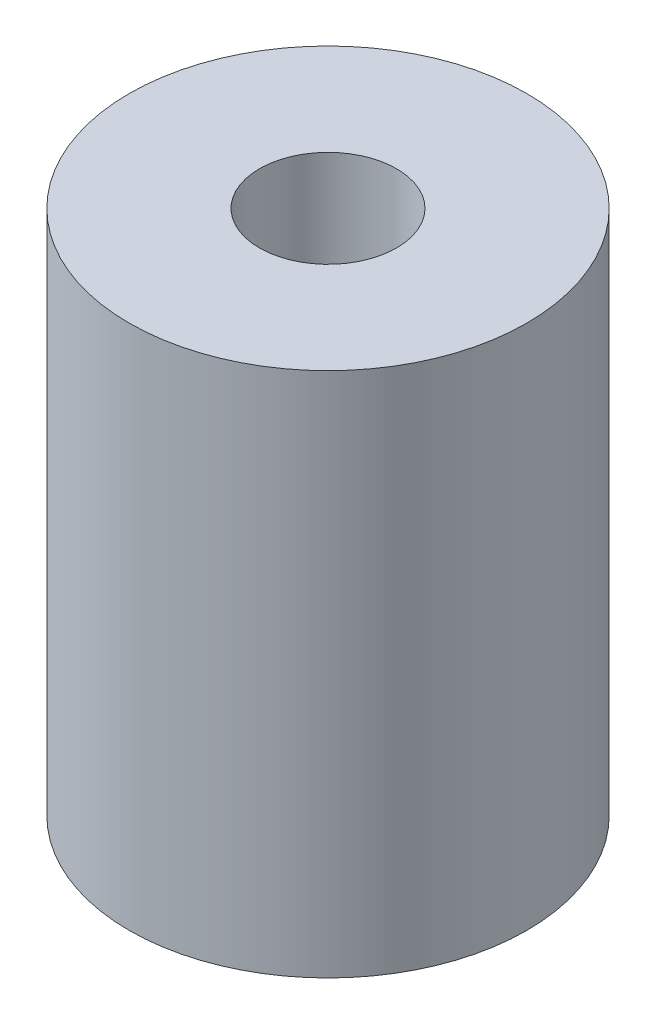
ISO-10303-21;
HEADER;
FILE_DESCRIPTION(('STEP AP214'),'2;1');
FILE_NAME('part.step','',(''),(''),'','','');
FILE_SCHEMA(('AUTOMOTIVE_DESIGN { 1 0 10303 214 1 1 1 1 }'));
ENDSEC;
DATA;
#1=APPLICATION_CONTEXT('core data for automotive mechanical design processes');
#2=APPLICATION_PROTOCOL_DEFINITION('international standard','automotive_design',2000,#1);
#3=PRODUCT_CONTEXT('',#1,'mechanical');
#4=PRODUCT('Part','Part','',(#3));
#5=PRODUCT_RELATED_PRODUCT_CATEGORY('part','',(#4));
#6=PRODUCT_DEFINITION_FORMATION('','',#4);
#7=PRODUCT_DEFINITION_CONTEXT('part definition',#1,'design');
#8=PRODUCT_DEFINITION('design','',#6,#7);
#9=PRODUCT_DEFINITION_SHAPE('','',#8);
#10=(LENGTH_UNIT() NAMED_UNIT(*) SI_UNIT(.MILLI.,.METRE.));
#11=(NAMED_UNIT(*) PLANE_ANGLE_UNIT() SI_UNIT($,.RADIAN.));
#12=(NAMED_UNIT(*) SI_UNIT($,.STERADIAN.) SOLID_ANGLE_UNIT());
#13=UNCERTAINTY_MEASURE_WITH_UNIT(LENGTH_MEASURE(1.E-05),#10,'distance_accuracy_value','');
#14=(GEOMETRIC_REPRESENTATION_CONTEXT(3) GLOBAL_UNCERTAINTY_ASSIGNED_CONTEXT((#13)) GLOBAL_UNIT_ASSIGNED_CONTEXT((#10,
#11,#12)) REPRESENTATION_CONTEXT('',''));
#15=CARTESIAN_POINT('',(0.,0.,0.));
#16=DIRECTION('',(0.,0.,1.));
#17=DIRECTION('',(1.,0.,0.));
#18=AXIS2_PLACEMENT_3D('',#15,#16,#17);
#19=CARTESIAN_POINT('',(0.,10.5156,0.));
#20=DIRECTION('',(0.,-1.,0.));
#21=DIRECTION('',(0.,0.,-1.));
#22=AXIS2_PLACEMENT_3D('',#19,#20,#21);
#23=CYLINDRICAL_SURFACE('',#22,3.9751);
#24=CARTESIAN_POINT('',(0.,10.5156,0.));
#25=DIRECTION('',(0.,1.,0.));
#26=DIRECTION('',(0.,0.,1.));
#27=AXIS2_PLACEMENT_3D('',#24,#25,#26);
#28=CIRCLE('',#27,3.9751);
#29=CARTESIAN_POINT('',(0.,10.5156,3.9751));
#30=VERTEX_POINT('',#29);
#31=EDGE_CURVE('E10',#30,#30,#28,.T.);
#32=ORIENTED_EDGE('',*,*,#31,.F.);
#33=EDGE_LOOP('',(#32));
#34=FACE_BOUND('',#33,.T.);
#35=CARTESIAN_POINT('',(0.,0.,0.));
#36=DIRECTION('',(0.,1.,0.));
#37=DIRECTION('',(0.,0.,1.));
#38=AXIS2_PLACEMENT_3D('',#35,#36,#37);
#39=CIRCLE('',#38,3.9751);
#40=CARTESIAN_POINT('',(0.,0.,3.9751));
#41=VERTEX_POINT('',#40);
#42=EDGE_CURVE('E36',#41,#41,#39,.T.);
#43=ORIENTED_EDGE('',*,*,#42,.T.);
#44=EDGE_LOOP('',(#43));
#45=FACE_BOUND('',#44,.T.);
#46=ADVANCED_FACE('F33',(#34,#45),#23,.T.);
#47=CARTESIAN_POINT('',(0.,10.5156,0.));
#48=DIRECTION('',(0.,1.,0.));
#49=DIRECTION('',(0.,0.,1.));
#50=AXIS2_PLACEMENT_3D('',#47,#48,#49);
#51=PLANE('',#50);
#52=CARTESIAN_POINT('',(0.,10.5156,0.));
#53=DIRECTION('',(0.,1.,0.));
#54=DIRECTION('',(0.,0.,1.));
#55=AXIS2_PLACEMENT_3D('',#52,#53,#54);
#56=CIRCLE('',#55,1.3716);
#57=CARTESIAN_POINT('',(0.,10.5156,1.3716));
#58=VERTEX_POINT('',#57);
#59=EDGE_CURVE('E45',#58,#58,#56,.T.);
#60=ORIENTED_EDGE('',*,*,#59,.F.);
#61=EDGE_LOOP('',(#60));
#62=FACE_BOUND('',#61,.T.);
#63=ORIENTED_EDGE('',*,*,#31,.T.);
#64=EDGE_LOOP('',(#63));
#65=FACE_BOUND('',#64,.T.);
#66=ADVANCED_FACE('F60',(#62,#65),#51,.T.);
#67=CARTESIAN_POINT('',(0.,0.,0.));
#68=DIRECTION('',(0.,1.,0.));
#69=DIRECTION('',(0.,0.,1.));
#70=AXIS2_PLACEMENT_3D('',#67,#68,#69);
#71=PLANE('',#70);
#72=CARTESIAN_POINT('',(0.,0.,0.));
#73=DIRECTION('',(0.,1.,0.));
#74=DIRECTION('',(0.,0.,1.));
#75=AXIS2_PLACEMENT_3D('',#72,#73,#74);
#76=CIRCLE('',#75,1.3716);
#77=CARTESIAN_POINT('',(0.,0.,1.3716));
#78=VERTEX_POINT('',#77);
#79=EDGE_CURVE('E43',#78,#78,#76,.T.);
#80=ORIENTED_EDGE('',*,*,#79,.T.);
#81=EDGE_LOOP('',(#80));
#82=FACE_BOUND('',#81,.T.);
#83=ORIENTED_EDGE('',*,*,#42,.F.);
#84=EDGE_LOOP('',(#83));
#85=FACE_BOUND('',#84,.T.);
#86=ADVANCED_FACE('F51',(#82,#85),#71,.F.);
#87=CARTESIAN_POINT('',(0.,0.,0.));
#88=DIRECTION('',(0.,1.,0.));
#89=DIRECTION('',(0.,0.,1.));
#90=AXIS2_PLACEMENT_3D('',#87,#88,#89);
#91=CYLINDRICAL_SURFACE('',#90,1.3716);
#92=ORIENTED_EDGE('',*,*,#79,.F.);
#93=EDGE_LOOP('',(#92));
#94=FACE_BOUND('',#93,.T.);
#95=ORIENTED_EDGE('',*,*,#59,.T.);
#96=EDGE_LOOP('',(#95));
#97=FACE_BOUND('',#96,.T.);
#98=ADVANCED_FACE('F54',(#94,#97),#91,.F.);
#99=CLOSED_SHELL('',(#46,#66,#86,#98));
#100=MANIFOLD_SOLID_BREP('B2',#99);
#101=ADVANCED_BREP_SHAPE_REPRESENTATION('',(#18,#100),#14);
#102=SHAPE_DEFINITION_REPRESENTATION(#9,#101);
ENDSEC;
END-ISO-10303-21;
